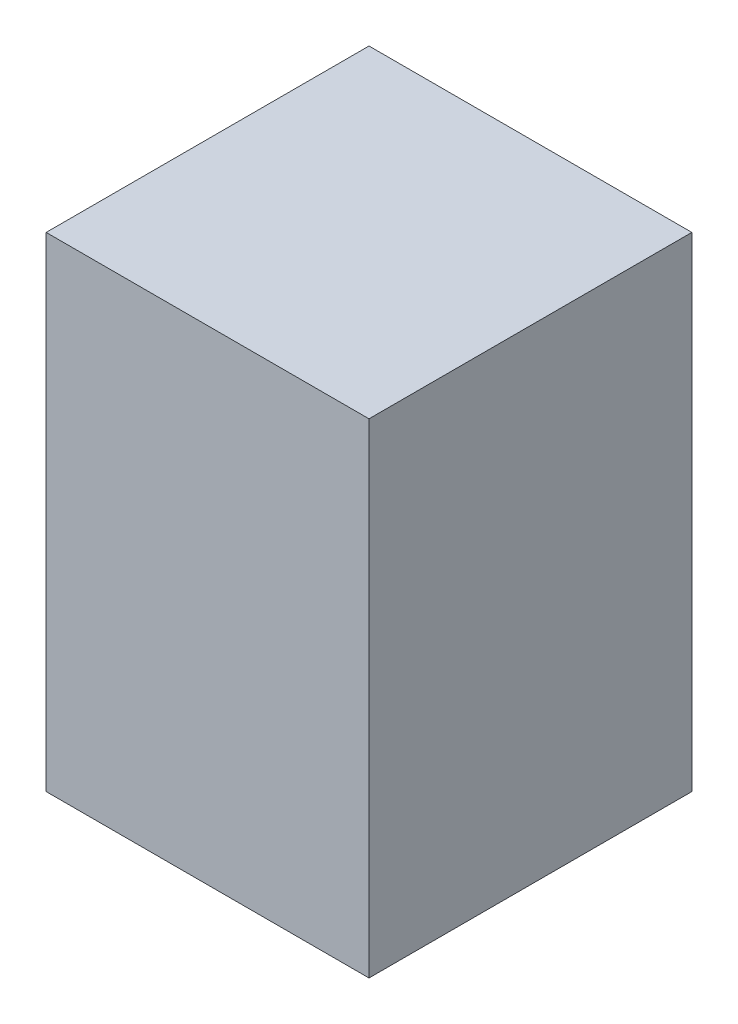
ISO-10303-21;
HEADER;
FILE_DESCRIPTION(('STEP AP214'),'2;1');
FILE_NAME('part.step','',(''),(''),'','','');
FILE_SCHEMA(('AUTOMOTIVE_DESIGN { 1 0 10303 214 1 1 1 1 }'));
ENDSEC;
DATA;
#1=APPLICATION_CONTEXT('core data for automotive mechanical design processes');
#2=APPLICATION_PROTOCOL_DEFINITION('international standard','automotive_design',2000,#1);
#3=PRODUCT_CONTEXT('',#1,'mechanical');
#4=PRODUCT('Part','Part','',(#3));
#5=PRODUCT_RELATED_PRODUCT_CATEGORY('part','',(#4));
#6=PRODUCT_DEFINITION_FORMATION('','',#4);
#7=PRODUCT_DEFINITION_CONTEXT('part definition',#1,'design');
#8=PRODUCT_DEFINITION('design','',#6,#7);
#9=PRODUCT_DEFINITION_SHAPE('','',#8);
#10=(LENGTH_UNIT() NAMED_UNIT(*) SI_UNIT(.MILLI.,.METRE.));
#11=(NAMED_UNIT(*) PLANE_ANGLE_UNIT() SI_UNIT($,.RADIAN.));
#12=(NAMED_UNIT(*) SI_UNIT($,.STERADIAN.) SOLID_ANGLE_UNIT());
#13=UNCERTAINTY_MEASURE_WITH_UNIT(LENGTH_MEASURE(1.E-05),#10,'distance_accuracy_value','');
#14=(GEOMETRIC_REPRESENTATION_CONTEXT(3) GLOBAL_UNCERTAINTY_ASSIGNED_CONTEXT((#13)) GLOBAL_UNIT_ASSIGNED_CONTEXT((#10,
#11,#12)) REPRESENTATION_CONTEXT('',''));
#15=CARTESIAN_POINT('',(0.,0.,0.));
#16=DIRECTION('',(0.,0.,1.));
#17=DIRECTION('',(1.,0.,0.));
#18=AXIS2_PLACEMENT_3D('',#15,#16,#17);
#19=CARTESIAN_POINT('',(60.,0.,-120.));
#20=DIRECTION('',(-1.,0.,0.));
#21=DIRECTION('',(0.,0.,1.));
#22=AXIS2_PLACEMENT_3D('',#19,#20,#21);
#23=PLANE('',#22);
#24=DIRECTION('',(0.,-1.,0.));
#25=VECTOR('',#24,1.);
#26=CARTESIAN_POINT('',(60.,0.,-40.));
#27=LINE('',#26,#25);
#28=CARTESIAN_POINT('',(60.,120.,-40.));
#29=VERTEX_POINT('',#28);
#30=CARTESIAN_POINT('',(60.,0.,-40.));
#31=VERTEX_POINT('',#30);
#32=EDGE_CURVE('E103',#29,#31,#27,.T.);
#33=ORIENTED_EDGE('',*,*,#32,.F.);
#34=DIRECTION('',(0.,0.,1.));
#35=VECTOR('',#34,1.);
#36=CARTESIAN_POINT('',(60.,120.,-120.));
#37=LINE('',#36,#35);
#38=CARTESIAN_POINT('',(60.,120.,-120.));
#39=VERTEX_POINT('',#38);
#40=EDGE_CURVE('E11',#39,#29,#37,.T.);
#41=ORIENTED_EDGE('',*,*,#40,.F.);
#42=DIRECTION('',(0.,-1.,0.));
#43=VECTOR('',#42,1.);
#44=CARTESIAN_POINT('',(60.,0.,-120.));
#45=LINE('',#44,#43);
#46=CARTESIAN_POINT('',(60.,0.,-120.));
#47=VERTEX_POINT('',#46);
#48=EDGE_CURVE('E97',#39,#47,#45,.T.);
#49=ORIENTED_EDGE('',*,*,#48,.T.);
#50=DIRECTION('',(0.,0.,1.));
#51=VECTOR('',#50,1.);
#52=CARTESIAN_POINT('',(60.,0.,-120.));
#53=LINE('',#52,#51);
#54=EDGE_CURVE('E42',#47,#31,#53,.T.);
#55=ORIENTED_EDGE('',*,*,#54,.T.);
#56=EDGE_LOOP('',(#33,#41,#49,#55));
#57=FACE_BOUND('',#56,.T.);
#58=ADVANCED_FACE('F39',(#57),#23,.T.);
#59=CARTESIAN_POINT('',(60.,120.,-120.));
#60=DIRECTION('',(0.,1.,0.));
#61=DIRECTION('',(0.,0.,1.));
#62=AXIS2_PLACEMENT_3D('',#59,#60,#61);
#63=PLANE('',#62);
#64=DIRECTION('',(-1.,0.,0.));
#65=VECTOR('',#64,1.);
#66=CARTESIAN_POINT('',(60.,120.,-40.));
#67=LINE('',#66,#65);
#68=CARTESIAN_POINT('',(140.,120.,-40.));
#69=VERTEX_POINT('',#68);
#70=EDGE_CURVE('E99',#69,#29,#67,.T.);
#71=ORIENTED_EDGE('',*,*,#70,.F.);
#72=DIRECTION('',(0.,0.,1.));
#73=VECTOR('',#72,1.);
#74=CARTESIAN_POINT('',(140.,120.,-120.));
#75=LINE('',#74,#73);
#76=CARTESIAN_POINT('',(140.,120.,-120.));
#77=VERTEX_POINT('',#76);
#78=EDGE_CURVE('E48',#77,#69,#75,.T.);
#79=ORIENTED_EDGE('',*,*,#78,.F.);
#80=DIRECTION('',(-1.,0.,0.));
#81=VECTOR('',#80,1.);
#82=CARTESIAN_POINT('',(60.,120.,-120.));
#83=LINE('',#82,#81);
#84=EDGE_CURVE('E94',#77,#39,#83,.T.);
#85=ORIENTED_EDGE('',*,*,#84,.T.);
#86=ORIENTED_EDGE('',*,*,#40,.T.);
#87=EDGE_LOOP('',(#71,#79,#85,#86));
#88=FACE_BOUND('',#87,.T.);
#89=ADVANCED_FACE('F113',(#88),#63,.T.);
#90=CARTESIAN_POINT('',(140.,0.,-120.));
#91=DIRECTION('',(1.,0.,0.));
#92=DIRECTION('',(0.,0.,-1.));
#93=AXIS2_PLACEMENT_3D('',#90,#91,#92);
#94=PLANE('',#93);
#95=DIRECTION('',(0.,1.,0.));
#96=VECTOR('',#95,1.);
#97=CARTESIAN_POINT('',(140.,0.,-40.));
#98=LINE('',#97,#96);
#99=CARTESIAN_POINT('',(140.,0.,-40.));
#100=VERTEX_POINT('',#99);
#101=EDGE_CURVE('E89',#100,#69,#98,.T.);
#102=ORIENTED_EDGE('',*,*,#101,.F.);
#103=DIRECTION('',(0.,0.,1.));
#104=VECTOR('',#103,1.);
#105=CARTESIAN_POINT('',(140.,0.,-120.));
#106=LINE('',#105,#104);
#107=CARTESIAN_POINT('',(140.,0.,-120.));
#108=VERTEX_POINT('',#107);
#109=EDGE_CURVE('E84',#108,#100,#106,.T.);
#110=ORIENTED_EDGE('',*,*,#109,.F.);
#111=DIRECTION('',(0.,1.,0.));
#112=VECTOR('',#111,1.);
#113=CARTESIAN_POINT('',(140.,0.,-120.));
#114=LINE('',#113,#112);
#115=EDGE_CURVE('E87',#108,#77,#114,.T.);
#116=ORIENTED_EDGE('',*,*,#115,.T.);
#117=ORIENTED_EDGE('',*,*,#78,.T.);
#118=EDGE_LOOP('',(#102,#110,#116,#117));
#119=FACE_BOUND('',#118,.T.);
#120=ADVANCED_FACE('F86',(#119),#94,.T.);
#121=CARTESIAN_POINT('',(60.,0.,-120.));
#122=DIRECTION('',(0.,-1.,0.));
#123=DIRECTION('',(0.,0.,-1.));
#124=AXIS2_PLACEMENT_3D('',#121,#122,#123);
#125=PLANE('',#124);
#126=DIRECTION('',(1.,0.,0.));
#127=VECTOR('',#126,1.);
#128=CARTESIAN_POINT('',(60.,0.,-40.));
#129=LINE('',#128,#127);
#130=EDGE_CURVE('E106',#31,#100,#129,.T.);
#131=ORIENTED_EDGE('',*,*,#130,.F.);
#132=ORIENTED_EDGE('',*,*,#54,.F.);
#133=DIRECTION('',(1.,0.,0.));
#134=VECTOR('',#133,1.);
#135=CARTESIAN_POINT('',(60.,0.,-120.));
#136=LINE('',#135,#134);
#137=EDGE_CURVE('E93',#47,#108,#136,.T.);
#138=ORIENTED_EDGE('',*,*,#137,.T.);
#139=ORIENTED_EDGE('',*,*,#109,.T.);
#140=EDGE_LOOP('',(#131,#132,#138,#139));
#141=FACE_BOUND('',#140,.T.);
#142=ADVANCED_FACE('F96',(#141),#125,.T.);
#143=CARTESIAN_POINT('',(0.,0.,-120.));
#144=DIRECTION('',(0.,0.,-1.));
#145=DIRECTION('',(-1.,0.,0.));
#146=AXIS2_PLACEMENT_3D('',#143,#144,#145);
#147=PLANE('',#146);
#148=ORIENTED_EDGE('',*,*,#48,.F.);
#149=ORIENTED_EDGE('',*,*,#84,.F.);
#150=ORIENTED_EDGE('',*,*,#115,.F.);
#151=ORIENTED_EDGE('',*,*,#137,.F.);
#152=EDGE_LOOP('',(#148,#149,#150,#151));
#153=FACE_BOUND('',#152,.T.);
#154=ADVANCED_FACE('F92',(#153),#147,.T.);
#155=CARTESIAN_POINT('',(0.,0.,-40.));
#156=DIRECTION('',(0.,0.,-1.));
#157=DIRECTION('',(-1.,0.,0.));
#158=AXIS2_PLACEMENT_3D('',#155,#156,#157);
#159=PLANE('',#158);
#160=ORIENTED_EDGE('',*,*,#32,.T.);
#161=ORIENTED_EDGE('',*,*,#130,.T.);
#162=ORIENTED_EDGE('',*,*,#101,.T.);
#163=ORIENTED_EDGE('',*,*,#70,.T.);
#164=EDGE_LOOP('',(#160,#161,#162,#163));
#165=FACE_BOUND('',#164,.T.);
#166=ADVANCED_FACE('F112',(#165),#159,.F.);
#167=CLOSED_SHELL('',(#58,#89,#120,#142,#154,#166));
#168=MANIFOLD_SOLID_BREP('B2',#167);
#169=ADVANCED_BREP_SHAPE_REPRESENTATION('',(#18,#168),#14);
#170=SHAPE_DEFINITION_REPRESENTATION(#9,#169);
ENDSEC;
END-ISO-10303-21;
